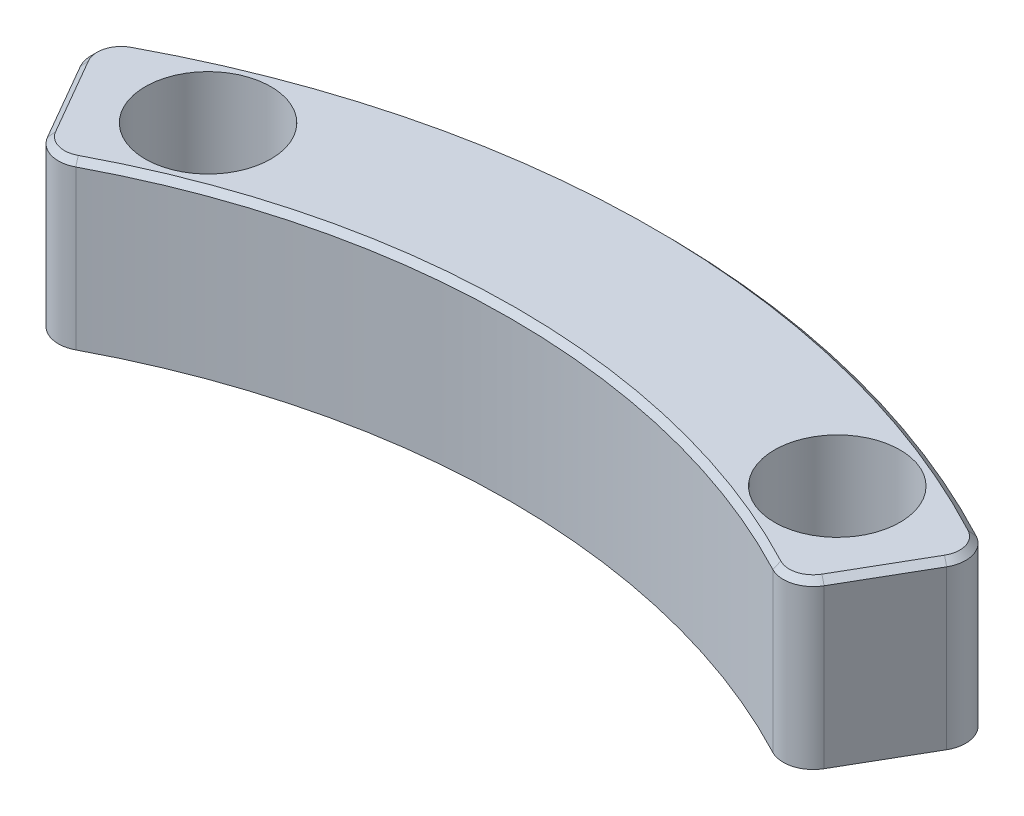
ISO-10303-21;
HEADER;
FILE_DESCRIPTION(('STEP AP214'),'2;1');
FILE_NAME('part.step','',(''),(''),'','','');
FILE_SCHEMA(('AUTOMOTIVE_DESIGN { 1 0 10303 214 1 1 1 1 }'));
ENDSEC;
DATA;
#1=APPLICATION_CONTEXT('core data for automotive mechanical design processes');
#2=APPLICATION_PROTOCOL_DEFINITION('international standard','automotive_design',2000,#1);
#3=PRODUCT_CONTEXT('',#1,'mechanical');
#4=PRODUCT('Part','Part','',(#3));
#5=PRODUCT_RELATED_PRODUCT_CATEGORY('part','',(#4));
#6=PRODUCT_DEFINITION_FORMATION('','',#4);
#7=PRODUCT_DEFINITION_CONTEXT('part definition',#1,'design');
#8=PRODUCT_DEFINITION('design','',#6,#7);
#9=PRODUCT_DEFINITION_SHAPE('','',#8);
#10=(LENGTH_UNIT() NAMED_UNIT(*) SI_UNIT(.MILLI.,.METRE.));
#11=(NAMED_UNIT(*) PLANE_ANGLE_UNIT() SI_UNIT($,.RADIAN.));
#12=(NAMED_UNIT(*) SI_UNIT($,.STERADIAN.) SOLID_ANGLE_UNIT());
#13=UNCERTAINTY_MEASURE_WITH_UNIT(LENGTH_MEASURE(1.E-05),#10,'distance_accuracy_value','');
#14=(GEOMETRIC_REPRESENTATION_CONTEXT(3) GLOBAL_UNCERTAINTY_ASSIGNED_CONTEXT((#13)) GLOBAL_UNIT_ASSIGNED_CONTEXT((#10,
#11,#12)) REPRESENTATION_CONTEXT('',''));
#15=CARTESIAN_POINT('',(0.,0.,0.));
#16=DIRECTION('',(0.,0.,1.));
#17=DIRECTION('',(1.,0.,0.));
#18=AXIS2_PLACEMENT_3D('',#15,#16,#17);
#19=CARTESIAN_POINT('',(0.,5.5,0.));
#20=DIRECTION('',(0.,-1.,0.));
#21=DIRECTION('',(0.,0.,-1.));
#22=AXIS2_PLACEMENT_3D('',#19,#20,#21);
#23=CYLINDRICAL_SURFACE('',#22,30.);
#24=DIRECTION('',(0.,-1.,0.));
#25=VECTOR('',#24,1.);
#26=CARTESIAN_POINT('',(-14.0951910438673,5.5,-26.4825525476092));
#27=LINE('',#26,#25);
#28=CARTESIAN_POINT('',(-14.0951910438673,0.,-26.4825525476092));
#29=VERTEX_POINT('',#28);
#30=CARTESIAN_POINT('',(-14.0951910438673,5.3,-26.4825525476092));
#31=VERTEX_POINT('',#30);
#32=EDGE_CURVE('E145',#29,#31,#27,.F.);
#33=ORIENTED_EDGE('',*,*,#32,.T.);
#34=CARTESIAN_POINT('',(0.,5.3,0.));
#35=DIRECTION('',(0.,1.,0.));
#36=DIRECTION('',(0.,0.,1.));
#37=AXIS2_PLACEMENT_3D('',#34,#35,#36);
#38=CIRCLE('',#37,30.);
#39=CARTESIAN_POINT('',(14.0951910438673,5.3,-26.4825525476092));
#40=VERTEX_POINT('',#39);
#41=EDGE_CURVE('E141',#31,#40,#38,.F.);
#42=ORIENTED_EDGE('',*,*,#41,.T.);
#43=DIRECTION('',(0.,-1.,0.));
#44=VECTOR('',#43,1.);
#45=CARTESIAN_POINT('',(14.0951910438673,5.5,-26.4825525476092));
#46=LINE('',#45,#44);
#47=CARTESIAN_POINT('',(14.0951910438673,0.,-26.4825525476092));
#48=VERTEX_POINT('',#47);
#49=EDGE_CURVE('E134',#40,#48,#46,.T.);
#50=ORIENTED_EDGE('',*,*,#49,.T.);
#51=CARTESIAN_POINT('',(0.,0.,0.));
#52=DIRECTION('',(0.,1.,0.));
#53=DIRECTION('',(0.,0.,1.));
#54=AXIS2_PLACEMENT_3D('',#51,#52,#53);
#55=CIRCLE('',#54,30.);
#56=EDGE_CURVE('E138',#48,#29,#55,.T.);
#57=ORIENTED_EDGE('',*,*,#56,.T.);
#58=EDGE_LOOP('',(#33,#42,#50,#57));
#59=FACE_BOUND('',#58,.T.);
#60=ADVANCED_FACE('F43',(#59),#23,.T.);
#61=CARTESIAN_POINT('',(-15.,5.5,-25.9807621135331));
#62=DIRECTION('',(0.866025403784439,0.,-0.5));
#63=DIRECTION('',(-0.5,0.,-0.866025403784439));
#64=AXIS2_PLACEMENT_3D('',#61,#62,#63);
#65=PLANE('',#64);
#66=DIRECTION('',(0.,-1.,0.));
#67=VECTOR('',#66,1.);
#68=CARTESIAN_POINT('',(-12.9903810567666,5.5,-22.5));
#69=LINE('',#68,#67);
#70=CARTESIAN_POINT('',(-12.9903810567666,0.,-22.5));
#71=VERTEX_POINT('',#70);
#72=CARTESIAN_POINT('',(-12.9903810567666,5.30000000000001,-22.5));
#73=VERTEX_POINT('',#72);
#74=EDGE_CURVE('E198',#71,#73,#69,.F.);
#75=ORIENTED_EDGE('',*,*,#74,.T.);
#76=DIRECTION('',(-0.5,0.,-0.866025403784439));
#77=VECTOR('',#76,1.);
#78=CARTESIAN_POINT('',(-14.4913767461895,5.30000000000001,-25.0998007960223));
#79=LINE('',#78,#77);
#80=CARTESIAN_POINT('',(-14.4913767461895,5.30000000000001,-25.0998007960223));
#81=VERTEX_POINT('',#80);
#82=EDGE_CURVE('E11',#73,#81,#79,.T.);
#83=ORIENTED_EDGE('',*,*,#82,.T.);
#84=DIRECTION('',(0.,-1.,0.));
#85=VECTOR('',#84,1.);
#86=CARTESIAN_POINT('',(-14.4913767461895,5.5,-25.0998007960223));
#87=LINE('',#86,#85);
#88=CARTESIAN_POINT('',(-14.4913767461895,0.,-25.0998007960223));
#89=VERTEX_POINT('',#88);
#90=EDGE_CURVE('E200',#81,#89,#87,.T.);
#91=ORIENTED_EDGE('',*,*,#90,.T.);
#92=DIRECTION('',(0.5,0.,0.866025403784439));
#93=VECTOR('',#92,1.);
#94=CARTESIAN_POINT('',(-15.,0.,-25.9807621135331));
#95=LINE('',#94,#93);
#96=EDGE_CURVE('E162',#89,#71,#95,.T.);
#97=ORIENTED_EDGE('',*,*,#96,.T.);
#98=EDGE_LOOP('',(#75,#83,#91,#97));
#99=FACE_BOUND('',#98,.T.);
#100=ADVANCED_FACE('F265',(#99),#65,.F.);
#101=CARTESIAN_POINT('',(0.,5.5,0.));
#102=DIRECTION('',(0.,-1.,0.));
#103=DIRECTION('',(0.,0.,-1.));
#104=AXIS2_PLACEMENT_3D('',#101,#102,#103);
#105=CYLINDRICAL_SURFACE('',#104,25.);
#106=DIRECTION('',(0.,-1.,0.));
#107=VECTOR('',#106,1.);
#108=CARTESIAN_POINT('',(11.6580342817136,5.5,-22.1153846153846));
#109=LINE('',#108,#107);
#110=CARTESIAN_POINT('',(11.6580342817136,0.,-22.1153846153846));
#111=VERTEX_POINT('',#110);
#112=CARTESIAN_POINT('',(11.6580342817136,5.3,-22.1153846153846));
#113=VERTEX_POINT('',#112);
#114=EDGE_CURVE('E195',#111,#113,#109,.F.);
#115=ORIENTED_EDGE('',*,*,#114,.T.);
#116=CARTESIAN_POINT('',(0.,5.3,0.));
#117=DIRECTION('',(0.,1.,0.));
#118=DIRECTION('',(0.,0.,1.));
#119=AXIS2_PLACEMENT_3D('',#116,#117,#118);
#120=CIRCLE('',#119,25.);
#121=CARTESIAN_POINT('',(-11.6580342817136,5.3,-22.1153846153846));
#122=VERTEX_POINT('',#121);
#123=EDGE_CURVE('E227',#113,#122,#120,.T.);
#124=ORIENTED_EDGE('',*,*,#123,.T.);
#125=DIRECTION('',(0.,-1.,0.));
#126=VECTOR('',#125,1.);
#127=CARTESIAN_POINT('',(-11.6580342817136,5.5,-22.1153846153846));
#128=LINE('',#127,#126);
#129=CARTESIAN_POINT('',(-11.6580342817136,0.,-22.1153846153846));
#130=VERTEX_POINT('',#129);
#131=EDGE_CURVE('E193',#122,#130,#128,.T.);
#132=ORIENTED_EDGE('',*,*,#131,.T.);
#133=CARTESIAN_POINT('',(0.,0.,0.));
#134=DIRECTION('',(0.,-1.,0.));
#135=DIRECTION('',(0.,0.,1.));
#136=AXIS2_PLACEMENT_3D('',#133,#134,#135);
#137=CIRCLE('',#136,25.);
#138=EDGE_CURVE('E166',#130,#111,#137,.T.);
#139=ORIENTED_EDGE('',*,*,#138,.T.);
#140=EDGE_LOOP('',(#115,#124,#132,#139));
#141=FACE_BOUND('',#140,.T.);
#142=ADVANCED_FACE('F272',(#141),#105,.F.);
#143=CARTESIAN_POINT('',(15.,5.5,-25.9807621135331));
#144=DIRECTION('',(-0.866025403784439,0.,-0.5));
#145=DIRECTION('',(-0.5,0.,0.866025403784439));
#146=AXIS2_PLACEMENT_3D('',#143,#144,#145);
#147=PLANE('',#146);
#148=DIRECTION('',(0.,-1.,0.));
#149=VECTOR('',#148,1.);
#150=CARTESIAN_POINT('',(14.4913767461895,5.5,-25.0998007960223));
#151=LINE('',#150,#149);
#152=CARTESIAN_POINT('',(14.4913767461895,0.,-25.0998007960223));
#153=VERTEX_POINT('',#152);
#154=CARTESIAN_POINT('',(14.4913767461895,5.3,-25.0998007960223));
#155=VERTEX_POINT('',#154);
#156=EDGE_CURVE('E151',#153,#155,#151,.F.);
#157=ORIENTED_EDGE('',*,*,#156,.T.);
#158=DIRECTION('',(-0.5,0.,0.866025403784439));
#159=VECTOR('',#158,1.);
#160=CARTESIAN_POINT('',(12.9903810567666,5.30000000000001,-22.5));
#161=LINE('',#160,#159);
#162=CARTESIAN_POINT('',(12.9903810567666,5.3,-22.5));
#163=VERTEX_POINT('',#162);
#164=EDGE_CURVE('E219',#155,#163,#161,.T.);
#165=ORIENTED_EDGE('',*,*,#164,.T.);
#166=DIRECTION('',(0.,-1.,0.));
#167=VECTOR('',#166,1.);
#168=CARTESIAN_POINT('',(12.9903810567666,5.5,-22.5));
#169=LINE('',#168,#167);
#170=CARTESIAN_POINT('',(12.9903810567666,0.,-22.5));
#171=VERTEX_POINT('',#170);
#172=EDGE_CURVE('E155',#163,#171,#169,.T.);
#173=ORIENTED_EDGE('',*,*,#172,.T.);
#174=DIRECTION('',(0.5,0.,-0.866025403784439));
#175=VECTOR('',#174,1.);
#176=CARTESIAN_POINT('',(15.,0.,-25.9807621135331));
#177=LINE('',#176,#175);
#178=EDGE_CURVE('E177',#171,#153,#177,.T.);
#179=ORIENTED_EDGE('',*,*,#178,.T.);
#180=EDGE_LOOP('',(#157,#165,#173,#179));
#181=FACE_BOUND('',#180,.T.);
#182=ADVANCED_FACE('F286',(#181),#147,.F.);
#183=CARTESIAN_POINT('',(0.,5.5,0.));
#184=DIRECTION('',(0.,1.,0.));
#185=DIRECTION('',(0.,0.,1.));
#186=AXIS2_PLACEMENT_3D('',#183,#184,#185);
#187=PLANE('',#186);
#188=CARTESIAN_POINT('',(12.1243556529822,5.5,-23.));
#189=DIRECTION('',(0.,1.,0.));
#190=DIRECTION('',(0.,0.,1.));
#191=AXIS2_PLACEMENT_3D('',#188,#189,#190);
#192=CIRCLE('',#191,0.800000000000002);
#193=CARTESIAN_POINT('',(11.7512985559673,5.5,-22.2923076923077));
#194=VERTEX_POINT('',#193);
#195=CARTESIAN_POINT('',(12.8171759760097,5.5,-22.6));
#196=VERTEX_POINT('',#195);
#197=EDGE_CURVE('E212',#194,#196,#192,.T.);
#198=ORIENTED_EDGE('',*,*,#197,.T.);
#199=DIRECTION('',(0.5,0.,-0.866025403784439));
#200=VECTOR('',#199,1.);
#201=CARTESIAN_POINT('',(14.3181716654326,5.5,-25.1998007960223));
#202=LINE('',#201,#200);
#203=CARTESIAN_POINT('',(14.3181716654326,5.5,-25.1998007960223));
#204=VERTEX_POINT('',#203);
#205=EDGE_CURVE('E216',#196,#204,#202,.T.);
#206=ORIENTED_EDGE('',*,*,#205,.T.);
#207=CARTESIAN_POINT('',(13.625351342405,5.5,-25.5998007960223));
#208=DIRECTION('',(0.,1.,0.));
#209=DIRECTION('',(0.,0.,1.));
#210=AXIS2_PLACEMENT_3D('',#207,#208,#209);
#211=CIRCLE('',#210,0.800000000000004);
#212=CARTESIAN_POINT('',(14.0012231035748,5.5,-26.3060021972918));
#213=VERTEX_POINT('',#212);
#214=EDGE_CURVE('E214',#204,#213,#211,.T.);
#215=ORIENTED_EDGE('',*,*,#214,.T.);
#216=CARTESIAN_POINT('',(0.,5.5,0.));
#217=DIRECTION('',(0.,1.,0.));
#218=DIRECTION('',(0.,0.,1.));
#219=AXIS2_PLACEMENT_3D('',#216,#217,#218);
#220=CIRCLE('',#219,29.8);
#221=CARTESIAN_POINT('',(-14.0012231035748,5.5,-26.3060021972918));
#222=VERTEX_POINT('',#221);
#223=EDGE_CURVE('E210',#213,#222,#220,.T.);
#224=ORIENTED_EDGE('',*,*,#223,.T.);
#225=CARTESIAN_POINT('',(-13.625351342405,5.5,-25.5998007960223));
#226=DIRECTION('',(0.,1.,0.));
#227=DIRECTION('',(0.,0.,1.));
#228=AXIS2_PLACEMENT_3D('',#225,#226,#227);
#229=CIRCLE('',#228,0.800000000000002);
#230=CARTESIAN_POINT('',(-14.3181716654326,5.5,-25.1998007960223));
#231=VERTEX_POINT('',#230);
#232=EDGE_CURVE('E206',#222,#231,#229,.T.);
#233=ORIENTED_EDGE('',*,*,#232,.T.);
#234=DIRECTION('',(0.5,0.,0.866025403784439));
#235=VECTOR('',#234,1.);
#236=CARTESIAN_POINT('',(-12.8171759760097,5.5,-22.6));
#237=LINE('',#236,#235);
#238=CARTESIAN_POINT('',(-12.8171759760097,5.5,-22.6));
#239=VERTEX_POINT('',#238);
#240=EDGE_CURVE('E202',#231,#239,#237,.T.);
#241=ORIENTED_EDGE('',*,*,#240,.T.);
#242=CARTESIAN_POINT('',(-12.1243556529822,5.5,-23.));
#243=DIRECTION('',(0.,1.,0.));
#244=DIRECTION('',(0.,0.,1.));
#245=AXIS2_PLACEMENT_3D('',#242,#243,#244);
#246=CIRCLE('',#245,0.800000000000004);
#247=CARTESIAN_POINT('',(-11.7512985559673,5.5,-22.2923076923077));
#248=VERTEX_POINT('',#247);
#249=EDGE_CURVE('E204',#239,#248,#246,.T.);
#250=ORIENTED_EDGE('',*,*,#249,.T.);
#251=CARTESIAN_POINT('',(0.,5.5,0.));
#252=DIRECTION('',(0.,1.,0.));
#253=DIRECTION('',(0.,0.,1.));
#254=AXIS2_PLACEMENT_3D('',#251,#252,#253);
#255=CIRCLE('',#254,25.2);
#256=EDGE_CURVE('E208',#248,#194,#255,.F.);
#257=ORIENTED_EDGE('',*,*,#256,.T.);
#258=EDGE_LOOP('',(#198,#206,#215,#224,#233,#241,#250,#257));
#259=FACE_BOUND('',#258,.T.);
#260=CARTESIAN_POINT('',(-10.52379439004,5.5,-25.4066871440604));
#261=DIRECTION('',(0.,1.,0.));
#262=DIRECTION('',(0.,0.,1.));
#263=AXIS2_PLACEMENT_3D('',#260,#261,#262);
#264=CIRCLE('',#263,2.1);
#265=CARTESIAN_POINT('',(-10.52379439004,5.5,-23.3066871440604));
#266=VERTEX_POINT('',#265);
#267=EDGE_CURVE('E169',#266,#266,#264,.T.);
#268=ORIENTED_EDGE('',*,*,#267,.F.);
#269=EDGE_LOOP('',(#268));
#270=FACE_BOUND('',#269,.T.);
#271=CARTESIAN_POINT('',(10.52379439004,5.5,-25.4066871440604));
#272=DIRECTION('',(0.,1.,0.));
#273=DIRECTION('',(0.,0.,1.));
#274=AXIS2_PLACEMENT_3D('',#271,#272,#273);
#275=CIRCLE('',#274,2.1);
#276=CARTESIAN_POINT('',(10.52379439004,5.5,-23.3066871440604));
#277=VERTEX_POINT('',#276);
#278=EDGE_CURVE('E536',#277,#277,#275,.T.);
#279=ORIENTED_EDGE('',*,*,#278,.F.);
#280=EDGE_LOOP('',(#279));
#281=FACE_BOUND('',#280,.T.);
#282=ADVANCED_FACE('F296',(#259,#270,#281),#187,.T.);
#283=CARTESIAN_POINT('',(0.,0.,0.));
#284=DIRECTION('',(0.,1.,0.));
#285=DIRECTION('',(0.,0.,1.));
#286=AXIS2_PLACEMENT_3D('',#283,#284,#285);
#287=PLANE('',#286);
#288=CARTESIAN_POINT('',(-10.52379439004,0.,-25.4066871440604));
#289=DIRECTION('',(0.,1.,0.));
#290=DIRECTION('',(0.,0.,1.));
#291=AXIS2_PLACEMENT_3D('',#288,#289,#290);
#292=CIRCLE('',#291,1.35);
#293=CARTESIAN_POINT('',(-10.52379439004,0.,-24.0566871440604));
#294=VERTEX_POINT('',#293);
#295=EDGE_CURVE('E182',#294,#294,#292,.T.);
#296=ORIENTED_EDGE('',*,*,#295,.T.);
#297=EDGE_LOOP('',(#296));
#298=FACE_BOUND('',#297,.T.);
#299=CARTESIAN_POINT('',(10.52379439004,0.,-25.4066871440604));
#300=DIRECTION('',(0.,1.,0.));
#301=DIRECTION('',(0.,0.,1.));
#302=AXIS2_PLACEMENT_3D('',#299,#300,#301);
#303=CIRCLE('',#302,1.35);
#304=CARTESIAN_POINT('',(10.52379439004,0.,-24.0566871440604));
#305=VERTEX_POINT('',#304);
#306=EDGE_CURVE('E186',#305,#305,#303,.T.);
#307=ORIENTED_EDGE('',*,*,#306,.T.);
#308=EDGE_LOOP('',(#307));
#309=FACE_BOUND('',#308,.T.);
#310=ORIENTED_EDGE('',*,*,#56,.F.);
#311=CARTESIAN_POINT('',(13.625351342405,0.,-25.5998007960223));
#312=DIRECTION('',(0.,1.,0.));
#313=DIRECTION('',(0.,0.,1.));
#314=AXIS2_PLACEMENT_3D('',#311,#312,#313);
#315=CIRCLE('',#314,1.);
#316=EDGE_CURVE('E148',#48,#153,#315,.F.);
#317=ORIENTED_EDGE('',*,*,#316,.T.);
#318=ORIENTED_EDGE('',*,*,#178,.F.);
#319=CARTESIAN_POINT('',(12.1243556529822,0.,-23.));
#320=DIRECTION('',(0.,1.,0.));
#321=DIRECTION('',(0.,0.,1.));
#322=AXIS2_PLACEMENT_3D('',#319,#320,#321);
#323=CIRCLE('',#322,1.);
#324=EDGE_CURVE('E156',#171,#111,#323,.F.);
#325=ORIENTED_EDGE('',*,*,#324,.T.);
#326=ORIENTED_EDGE('',*,*,#138,.F.);
#327=CARTESIAN_POINT('',(-12.1243556529822,0.,-23.));
#328=DIRECTION('',(0.,1.,0.));
#329=DIRECTION('',(0.,0.,1.));
#330=AXIS2_PLACEMENT_3D('',#327,#328,#329);
#331=CIRCLE('',#330,1.);
#332=EDGE_CURVE('E144',#130,#71,#331,.F.);
#333=ORIENTED_EDGE('',*,*,#332,.T.);
#334=ORIENTED_EDGE('',*,*,#96,.F.);
#335=CARTESIAN_POINT('',(-13.625351342405,0.,-25.5998007960223));
#336=DIRECTION('',(0.,1.,0.));
#337=DIRECTION('',(0.,0.,1.));
#338=AXIS2_PLACEMENT_3D('',#335,#336,#337);
#339=CIRCLE('',#338,1.);
#340=EDGE_CURVE('E161',#89,#29,#339,.F.);
#341=ORIENTED_EDGE('',*,*,#340,.T.);
#342=EDGE_LOOP('',(#310,#317,#318,#325,#326,#333,#334,#341));
#343=FACE_BOUND('',#342,.T.);
#344=ADVANCED_FACE('F158',(#298,#309,#343),#287,.F.);
#345=CARTESIAN_POINT('',(10.52379439004,2.5,-25.4066871440604));
#346=DIRECTION('',(0.,1.,0.));
#347=DIRECTION('',(0.,0.,1.));
#348=AXIS2_PLACEMENT_3D('',#345,#346,#347);
#349=CYLINDRICAL_SURFACE('',#348,2.1);
#350=CARTESIAN_POINT('',(10.52379439004,2.5,-25.4066871440604));
#351=DIRECTION('',(0.,1.,0.));
#352=DIRECTION('',(0.,0.,1.));
#353=AXIS2_PLACEMENT_3D('',#350,#351,#352);
#354=CIRCLE('',#353,2.1);
#355=CARTESIAN_POINT('',(10.52379439004,2.5,-23.3066871440604));
#356=VERTEX_POINT('',#355);
#357=EDGE_CURVE('E172',#356,#356,#354,.T.);
#358=ORIENTED_EDGE('',*,*,#357,.F.);
#359=EDGE_LOOP('',(#358));
#360=FACE_BOUND('',#359,.T.);
#361=ORIENTED_EDGE('',*,*,#278,.T.);
#362=EDGE_LOOP('',(#361));
#363=FACE_BOUND('',#362,.T.);
#364=ADVANCED_FACE('F424',(#360,#363),#349,.F.);
#365=CARTESIAN_POINT('',(10.52379439004,2.5,-25.4066871440604));
#366=DIRECTION('',(0.,1.,0.));
#367=DIRECTION('',(0.,0.,1.));
#368=AXIS2_PLACEMENT_3D('',#365,#366,#367);
#369=PLANE('',#368);
#370=CARTESIAN_POINT('',(10.52379439004,2.5,-25.4066871440604));
#371=DIRECTION('',(0.,1.,0.));
#372=DIRECTION('',(0.,0.,1.));
#373=AXIS2_PLACEMENT_3D('',#370,#371,#372);
#374=CIRCLE('',#373,1.35);
#375=CARTESIAN_POINT('',(10.52379439004,2.5,-24.0566871440604));
#376=VERTEX_POINT('',#375);
#377=EDGE_CURVE('E183',#376,#376,#374,.T.);
#378=ORIENTED_EDGE('',*,*,#377,.F.);
#379=EDGE_LOOP('',(#378));
#380=FACE_BOUND('',#379,.T.);
#381=ORIENTED_EDGE('',*,*,#357,.T.);
#382=EDGE_LOOP('',(#381));
#383=FACE_BOUND('',#382,.T.);
#384=ADVANCED_FACE('F433',(#380,#383),#369,.T.);
#385=CARTESIAN_POINT('',(-10.52379439004,2.5,-25.4066871440604));
#386=DIRECTION('',(0.,1.,0.));
#387=DIRECTION('',(0.,0.,1.));
#388=AXIS2_PLACEMENT_3D('',#385,#386,#387);
#389=CYLINDRICAL_SURFACE('',#388,2.1);
#390=CARTESIAN_POINT('',(-10.52379439004,2.5,-25.4066871440604));
#391=DIRECTION('',(0.,1.,0.));
#392=DIRECTION('',(0.,0.,1.));
#393=AXIS2_PLACEMENT_3D('',#390,#391,#392);
#394=CIRCLE('',#393,2.1);
#395=CARTESIAN_POINT('',(-10.52379439004,2.5,-23.3066871440604));
#396=VERTEX_POINT('',#395);
#397=EDGE_CURVE('E163',#396,#396,#394,.T.);
#398=ORIENTED_EDGE('',*,*,#397,.F.);
#399=EDGE_LOOP('',(#398));
#400=FACE_BOUND('',#399,.T.);
#401=ORIENTED_EDGE('',*,*,#267,.T.);
#402=EDGE_LOOP('',(#401));
#403=FACE_BOUND('',#402,.T.);
#404=ADVANCED_FACE('F442',(#400,#403),#389,.F.);
#405=CARTESIAN_POINT('',(-10.52379439004,2.5,-25.4066871440604));
#406=DIRECTION('',(0.,1.,0.));
#407=DIRECTION('',(0.,0.,1.));
#408=AXIS2_PLACEMENT_3D('',#405,#406,#407);
#409=PLANE('',#408);
#410=CARTESIAN_POINT('',(-10.52379439004,2.5,-25.4066871440604));
#411=DIRECTION('',(0.,1.,0.));
#412=DIRECTION('',(0.,0.,1.));
#413=AXIS2_PLACEMENT_3D('',#410,#411,#412);
#414=CIRCLE('',#413,1.35);
#415=CARTESIAN_POINT('',(-10.52379439004,2.5,-24.0566871440604));
#416=VERTEX_POINT('',#415);
#417=EDGE_CURVE('E179',#416,#416,#414,.T.);
#418=ORIENTED_EDGE('',*,*,#417,.F.);
#419=EDGE_LOOP('',(#418));
#420=FACE_BOUND('',#419,.T.);
#421=ORIENTED_EDGE('',*,*,#397,.T.);
#422=EDGE_LOOP('',(#421));
#423=FACE_BOUND('',#422,.T.);
#424=ADVANCED_FACE('F451',(#420,#423),#409,.T.);
#425=CARTESIAN_POINT('',(-10.52379439004,-1.5,-25.4066871440604));
#426=DIRECTION('',(0.,1.,0.));
#427=DIRECTION('',(0.,0.,1.));
#428=AXIS2_PLACEMENT_3D('',#425,#426,#427);
#429=CYLINDRICAL_SURFACE('',#428,1.35);
#430=ORIENTED_EDGE('',*,*,#417,.T.);
#431=EDGE_LOOP('',(#430));
#432=FACE_BOUND('',#431,.T.);
#433=ORIENTED_EDGE('',*,*,#295,.F.);
#434=EDGE_LOOP('',(#433));
#435=FACE_BOUND('',#434,.T.);
#436=ADVANCED_FACE('F460',(#432,#435),#429,.F.);
#437=CARTESIAN_POINT('',(10.52379439004,-1.5,-25.4066871440604));
#438=DIRECTION('',(0.,1.,0.));
#439=DIRECTION('',(0.,0.,1.));
#440=AXIS2_PLACEMENT_3D('',#437,#438,#439);
#441=CYLINDRICAL_SURFACE('',#440,1.35);
#442=ORIENTED_EDGE('',*,*,#377,.T.);
#443=EDGE_LOOP('',(#442));
#444=FACE_BOUND('',#443,.T.);
#445=ORIENTED_EDGE('',*,*,#306,.F.);
#446=EDGE_LOOP('',(#445));
#447=FACE_BOUND('',#446,.T.);
#448=ADVANCED_FACE('F323',(#444,#447),#441,.F.);
#449=CARTESIAN_POINT('',(13.625351342405,5.5,-25.5998007960223));
#450=DIRECTION('',(0.,-1.,0.));
#451=DIRECTION('',(0.,0.,-1.));
#452=AXIS2_PLACEMENT_3D('',#449,#450,#451);
#453=CYLINDRICAL_SURFACE('',#452,1.);
#454=ORIENTED_EDGE('',*,*,#49,.F.);
#455=CARTESIAN_POINT('',(13.625351342405,5.3,-25.5998007960223));
#456=DIRECTION('',(0.,1.,0.));
#457=DIRECTION('',(0.,0.,1.));
#458=AXIS2_PLACEMENT_3D('',#455,#456,#457);
#459=CIRCLE('',#458,1.);
#460=EDGE_CURVE('E222',#40,#155,#459,.F.);
#461=ORIENTED_EDGE('',*,*,#460,.T.);
#462=ORIENTED_EDGE('',*,*,#156,.F.);
#463=ORIENTED_EDGE('',*,*,#316,.F.);
#464=EDGE_LOOP('',(#454,#461,#462,#463));
#465=FACE_BOUND('',#464,.T.);
#466=ADVANCED_FACE('F149',(#465),#453,.T.);
#467=CARTESIAN_POINT('',(12.1243556529822,5.5,-23.));
#468=DIRECTION('',(0.,-1.,0.));
#469=DIRECTION('',(0.,0.,-1.));
#470=AXIS2_PLACEMENT_3D('',#467,#468,#469);
#471=CYLINDRICAL_SURFACE('',#470,1.);
#472=ORIENTED_EDGE('',*,*,#172,.F.);
#473=CARTESIAN_POINT('',(12.1243556529822,5.3,-23.));
#474=DIRECTION('',(0.,1.,0.));
#475=DIRECTION('',(0.,0.,1.));
#476=AXIS2_PLACEMENT_3D('',#473,#474,#475);
#477=CIRCLE('',#476,1.);
#478=EDGE_CURVE('E224',#163,#113,#477,.F.);
#479=ORIENTED_EDGE('',*,*,#478,.T.);
#480=ORIENTED_EDGE('',*,*,#114,.F.);
#481=ORIENTED_EDGE('',*,*,#324,.F.);
#482=EDGE_LOOP('',(#472,#479,#480,#481));
#483=FACE_BOUND('',#482,.T.);
#484=ADVANCED_FACE('F276',(#483),#471,.T.);
#485=CARTESIAN_POINT('',(-13.625351342405,5.5,-25.5998007960223));
#486=DIRECTION('',(0.,-1.,0.));
#487=DIRECTION('',(0.,0.,-1.));
#488=AXIS2_PLACEMENT_3D('',#485,#486,#487);
#489=CYLINDRICAL_SURFACE('',#488,1.);
#490=ORIENTED_EDGE('',*,*,#90,.F.);
#491=CARTESIAN_POINT('',(-13.625351342405,5.3,-25.5998007960223));
#492=DIRECTION('',(0.,1.,0.));
#493=DIRECTION('',(0.,0.,1.));
#494=AXIS2_PLACEMENT_3D('',#491,#492,#493);
#495=CIRCLE('',#494,1.);
#496=EDGE_CURVE('E229',#81,#31,#495,.F.);
#497=ORIENTED_EDGE('',*,*,#496,.T.);
#498=ORIENTED_EDGE('',*,*,#32,.F.);
#499=ORIENTED_EDGE('',*,*,#340,.F.);
#500=EDGE_LOOP('',(#490,#497,#498,#499));
#501=FACE_BOUND('',#500,.T.);
#502=ADVANCED_FACE('F264',(#501),#489,.T.);
#503=CARTESIAN_POINT('',(-12.1243556529822,5.5,-23.));
#504=DIRECTION('',(0.,-1.,0.));
#505=DIRECTION('',(0.,0.,-1.));
#506=AXIS2_PLACEMENT_3D('',#503,#504,#505);
#507=CYLINDRICAL_SURFACE('',#506,1.);
#508=ORIENTED_EDGE('',*,*,#131,.F.);
#509=CARTESIAN_POINT('',(-12.1243556529822,5.3,-23.));
#510=DIRECTION('',(0.,1.,0.));
#511=DIRECTION('',(0.,0.,1.));
#512=AXIS2_PLACEMENT_3D('',#509,#510,#511);
#513=CIRCLE('',#512,1.);
#514=EDGE_CURVE('E53',#122,#73,#513,.F.);
#515=ORIENTED_EDGE('',*,*,#514,.T.);
#516=ORIENTED_EDGE('',*,*,#74,.F.);
#517=ORIENTED_EDGE('',*,*,#332,.F.);
#518=EDGE_LOOP('',(#508,#515,#516,#517));
#519=FACE_BOUND('',#518,.T.);
#520=ADVANCED_FACE('F267',(#519),#507,.T.);
#521=CARTESIAN_POINT('',(0.17320508075687,5.5,-0.0999999999999898));
#522=DIRECTION('',(-0.612372435695789,0.707106781186554,0.353553390593271));
#523=DIRECTION('',(-0.5,0.,-0.866025403784439));
#524=AXIS2_PLACEMENT_3D('',#521,#522,#523);
#525=PLANE('',#524);
#526=DIRECTION('',(0.612372435695803,0.707106781186537,-0.353553390593279));
#527=VECTOR('',#526,1.);
#528=CARTESIAN_POINT('',(-14.4913767461895,5.30000000000001,-25.0998007960223));
#529=LINE('',#528,#527);
#530=EDGE_CURVE('E247',#81,#231,#529,.T.);
#531=ORIENTED_EDGE('',*,*,#530,.F.);
#532=ORIENTED_EDGE('',*,*,#82,.F.);
#533=DIRECTION('',(-0.6123724356958,-0.70710678118654,0.353553390593281));
#534=VECTOR('',#533,1.);
#535=CARTESIAN_POINT('',(-12.8171759760097,5.5,-22.6));
#536=LINE('',#535,#534);
#537=EDGE_CURVE('E48',#239,#73,#536,.T.);
#538=ORIENTED_EDGE('',*,*,#537,.F.);
#539=ORIENTED_EDGE('',*,*,#240,.F.);
#540=EDGE_LOOP('',(#531,#532,#538,#539));
#541=FACE_BOUND('',#540,.T.);
#542=ADVANCED_FACE('F46',(#541),#525,.T.);
#543=CARTESIAN_POINT('',(-12.1243556529822,5.5,-23.));
#544=DIRECTION('',(0.,-1.,0.));
#545=DIRECTION('',(0.,0.,-1.));
#546=AXIS2_PLACEMENT_3D('',#543,#544,#545);
#547=CONICAL_SURFACE('',#546,0.800000000000004,0.785398163397451);
#548=ORIENTED_EDGE('',*,*,#537,.T.);
#549=ORIENTED_EDGE('',*,*,#514,.F.);
#550=DIRECTION('',(0.329739003836193,-0.707106781186546,0.625517537203489));
#551=VECTOR('',#550,1.);
#552=CARTESIAN_POINT('',(-11.7512985559673,5.5,-22.2923076923077));
#553=LINE('',#552,#551);
#554=EDGE_CURVE('E245',#248,#122,#553,.T.);
#555=ORIENTED_EDGE('',*,*,#554,.F.);
#556=ORIENTED_EDGE('',*,*,#249,.F.);
#557=EDGE_LOOP('',(#548,#549,#555,#556));
#558=FACE_BOUND('',#557,.T.);
#559=ADVANCED_FACE('F257',(#558),#547,.T.);
#560=CARTESIAN_POINT('',(-13.625351342405,5.5,-25.5998007960223));
#561=DIRECTION('',(0.,-1.,0.));
#562=DIRECTION('',(0.,0.,-1.));
#563=AXIS2_PLACEMENT_3D('',#560,#561,#562);
#564=CONICAL_SURFACE('',#563,0.800000000000003,0.785398163397453);
#565=ORIENTED_EDGE('',*,*,#530,.T.);
#566=ORIENTED_EDGE('',*,*,#232,.F.);
#567=DIRECTION('',(0.332226838974616,0.707106781186547,0.624199749651452));
#568=VECTOR('',#567,1.);
#569=CARTESIAN_POINT('',(-14.0951910438673,5.3,-26.4825525476092));
#570=LINE('',#569,#568);
#571=EDGE_CURVE('E242',#31,#222,#570,.T.);
#572=ORIENTED_EDGE('',*,*,#571,.F.);
#573=ORIENTED_EDGE('',*,*,#496,.F.);
#574=EDGE_LOOP('',(#565,#566,#572,#573));
#575=FACE_BOUND('',#574,.T.);
#576=ADVANCED_FACE('F262',(#575),#564,.T.);
#577=CARTESIAN_POINT('',(0.,5.5,0.));
#578=DIRECTION('',(0.,1.,0.));
#579=DIRECTION('',(0.,0.,1.));
#580=AXIS2_PLACEMENT_3D('',#577,#578,#579);
#581=CONICAL_SURFACE('',#580,25.2,0.785398163397448);
#582=ORIENTED_EDGE('',*,*,#554,.T.);
#583=ORIENTED_EDGE('',*,*,#123,.F.);
#584=DIRECTION('',(-0.329739003836196,-0.707106781186551,0.625517537203481));
#585=VECTOR('',#584,1.);
#586=CARTESIAN_POINT('',(11.7512985559673,5.5,-22.2923076923077));
#587=LINE('',#586,#585);
#588=EDGE_CURVE('E239',#194,#113,#587,.T.);
#589=ORIENTED_EDGE('',*,*,#588,.F.);
#590=ORIENTED_EDGE('',*,*,#256,.F.);
#591=EDGE_LOOP('',(#582,#583,#589,#590));
#592=FACE_BOUND('',#591,.T.);
#593=ADVANCED_FACE('F300',(#592),#581,.F.);
#594=CARTESIAN_POINT('',(0.,5.5,0.));
#595=DIRECTION('',(0.,-1.,0.));
#596=DIRECTION('',(0.,0.,-1.));
#597=AXIS2_PLACEMENT_3D('',#594,#595,#596);
#598=CONICAL_SURFACE('',#597,29.8,0.785398163397448);
#599=ORIENTED_EDGE('',*,*,#571,.T.);
#600=ORIENTED_EDGE('',*,*,#223,.F.);
#601=DIRECTION('',(-0.332226838974616,0.707106781186547,0.624199749651452));
#602=VECTOR('',#601,1.);
#603=CARTESIAN_POINT('',(14.0951910438673,5.3,-26.4825525476092));
#604=LINE('',#603,#602);
#605=EDGE_CURVE('E236',#40,#213,#604,.T.);
#606=ORIENTED_EDGE('',*,*,#605,.F.);
#607=ORIENTED_EDGE('',*,*,#41,.F.);
#608=EDGE_LOOP('',(#599,#600,#606,#607));
#609=FACE_BOUND('',#608,.T.);
#610=ADVANCED_FACE('F302',(#609),#598,.T.);
#611=CARTESIAN_POINT('',(12.1243556529822,5.5,-23.));
#612=DIRECTION('',(0.,-1.,0.));
#613=DIRECTION('',(0.,0.,-1.));
#614=AXIS2_PLACEMENT_3D('',#611,#612,#613);
#615=CONICAL_SURFACE('',#614,0.800000000000001,0.785398163397456);
#616=ORIENTED_EDGE('',*,*,#588,.T.);
#617=ORIENTED_EDGE('',*,*,#478,.F.);
#618=DIRECTION('',(0.612372435695799,-0.707106781186542,0.353553390593277));
#619=VECTOR('',#618,1.);
#620=CARTESIAN_POINT('',(12.8171759760097,5.5,-22.6));
#621=LINE('',#620,#619);
#622=EDGE_CURVE('E234',#196,#163,#621,.T.);
#623=ORIENTED_EDGE('',*,*,#622,.F.);
#624=ORIENTED_EDGE('',*,*,#197,.F.);
#625=EDGE_LOOP('',(#616,#617,#623,#624));
#626=FACE_BOUND('',#625,.T.);
#627=ADVANCED_FACE('F280',(#626),#615,.T.);
#628=CARTESIAN_POINT('',(13.625351342405,5.5,-25.5998007960223));
#629=DIRECTION('',(0.,-1.,0.));
#630=DIRECTION('',(0.,0.,-1.));
#631=AXIS2_PLACEMENT_3D('',#628,#629,#630);
#632=CONICAL_SURFACE('',#631,0.800000000000004,0.785398163397451);
#633=ORIENTED_EDGE('',*,*,#605,.T.);
#634=ORIENTED_EDGE('',*,*,#214,.F.);
#635=DIRECTION('',(-0.612372435695796,0.707106781186544,-0.353553390593278));
#636=VECTOR('',#635,1.);
#637=CARTESIAN_POINT('',(14.4913767461895,5.3,-25.0998007960223));
#638=LINE('',#637,#636);
#639=EDGE_CURVE('E232',#155,#204,#638,.T.);
#640=ORIENTED_EDGE('',*,*,#639,.F.);
#641=ORIENTED_EDGE('',*,*,#460,.F.);
#642=EDGE_LOOP('',(#633,#634,#640,#641));
#643=FACE_BOUND('',#642,.T.);
#644=ADVANCED_FACE('F293',(#643),#632,.T.);
#645=CARTESIAN_POINT('',(-0.173205080756857,5.5,-0.099999999999982));
#646=DIRECTION('',(0.612372435695792,0.707106781186551,0.353553390593272));
#647=DIRECTION('',(-0.5,0.,0.866025403784439));
#648=AXIS2_PLACEMENT_3D('',#645,#646,#647);
#649=PLANE('',#648);
#650=ORIENTED_EDGE('',*,*,#622,.T.);
#651=ORIENTED_EDGE('',*,*,#164,.F.);
#652=ORIENTED_EDGE('',*,*,#639,.T.);
#653=ORIENTED_EDGE('',*,*,#205,.F.);
#654=EDGE_LOOP('',(#650,#651,#652,#653));
#655=FACE_BOUND('',#654,.T.);
#656=ADVANCED_FACE('F289',(#655),#649,.T.);
#657=CLOSED_SHELL('',(#60,#100,#142,#182,#282,#344,#364,#384,#404,#424,#436,#448,#466,#484,#502,
#520,#542,#559,#576,#593,#610,#627,#644,#656));
#658=MANIFOLD_SOLID_BREP('B2',#657);
#659=ADVANCED_BREP_SHAPE_REPRESENTATION('',(#18,#658),#14);
#660=SHAPE_DEFINITION_REPRESENTATION(#9,#659);
ENDSEC;
END-ISO-10303-21;
